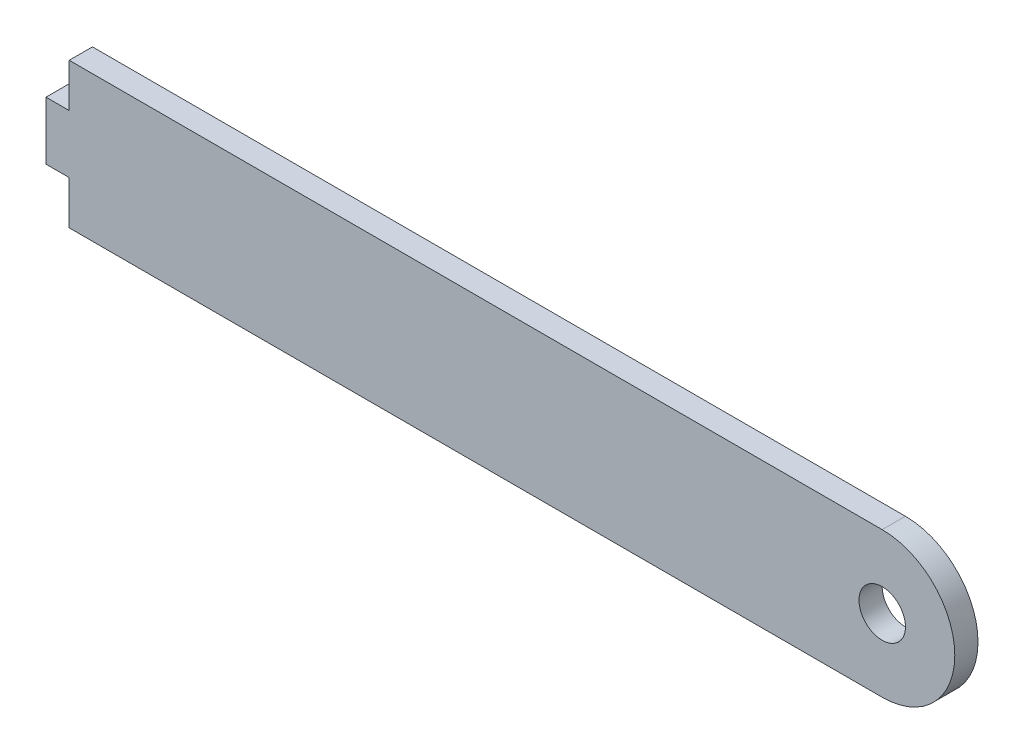
ISO-10303-21;
HEADER;
FILE_DESCRIPTION(('STEP AP214'),'2;1');
FILE_NAME('part.step','',(''),(''),'','','');
FILE_SCHEMA(('AUTOMOTIVE_DESIGN { 1 0 10303 214 1 1 1 1 }'));
ENDSEC;
DATA;
#1=APPLICATION_CONTEXT('core data for automotive mechanical design processes');
#2=APPLICATION_PROTOCOL_DEFINITION('international standard','automotive_design',2000,#1);
#3=PRODUCT_CONTEXT('',#1,'mechanical');
#4=PRODUCT('Part','Part','',(#3));
#5=PRODUCT_RELATED_PRODUCT_CATEGORY('part','',(#4));
#6=PRODUCT_DEFINITION_FORMATION('','',#4);
#7=PRODUCT_DEFINITION_CONTEXT('part definition',#1,'design');
#8=PRODUCT_DEFINITION('design','',#6,#7);
#9=PRODUCT_DEFINITION_SHAPE('','',#8);
#10=(LENGTH_UNIT() NAMED_UNIT(*) SI_UNIT(.MILLI.,.METRE.));
#11=(NAMED_UNIT(*) PLANE_ANGLE_UNIT() SI_UNIT($,.RADIAN.));
#12=(NAMED_UNIT(*) SI_UNIT($,.STERADIAN.) SOLID_ANGLE_UNIT());
#13=UNCERTAINTY_MEASURE_WITH_UNIT(LENGTH_MEASURE(1.E-05),#10,'distance_accuracy_value','');
#14=(GEOMETRIC_REPRESENTATION_CONTEXT(3) GLOBAL_UNCERTAINTY_ASSIGNED_CONTEXT((#13)) GLOBAL_UNIT_ASSIGNED_CONTEXT((#10,
#11,#12)) REPRESENTATION_CONTEXT('',''));
#15=CARTESIAN_POINT('',(0.,0.,0.));
#16=DIRECTION('',(0.,0.,1.));
#17=DIRECTION('',(1.,0.,0.));
#18=AXIS2_PLACEMENT_3D('',#15,#16,#17);
#19=CARTESIAN_POINT('',(91.7971875583889,-1.4616329157713,4.));
#20=DIRECTION('',(0.,0.,1.));
#21=DIRECTION('',(1.,0.,0.));
#22=AXIS2_PLACEMENT_3D('',#19,#20,#21);
#23=PLANE('',#22);
#24=DIRECTION('',(0.,-1.,0.));
#25=VECTOR('',#24,1.);
#26=CARTESIAN_POINT('',(-48.2028124416111,11.0383670842287,4.));
#27=LINE('',#26,#25);
#28=CARTESIAN_POINT('',(-48.2028124416111,11.0383670842287,4.));
#29=VERTEX_POINT('',#28);
#30=CARTESIAN_POINT('',(-48.2028124416111,3.53836708422869,4.));
#31=VERTEX_POINT('',#30);
#32=EDGE_CURVE('E168',#29,#31,#27,.T.);
#33=ORIENTED_EDGE('',*,*,#32,.T.);
#34=DIRECTION('',(-1.,0.,0.));
#35=VECTOR('',#34,1.);
#36=CARTESIAN_POINT('',(-48.2028124416111,3.53836708422869,4.));
#37=LINE('',#36,#35);
#38=CARTESIAN_POINT('',(-52.2028124416111,3.53836708422869,4.));
#39=VERTEX_POINT('',#38);
#40=EDGE_CURVE('E104',#31,#39,#37,.T.);
#41=ORIENTED_EDGE('',*,*,#40,.T.);
#42=DIRECTION('',(0.,-1.,0.));
#43=VECTOR('',#42,1.);
#44=CARTESIAN_POINT('',(-52.2028124416111,-6.46163291577131,4.));
#45=LINE('',#44,#43);
#46=CARTESIAN_POINT('',(-52.2028124416111,-6.46163291577131,4.));
#47=VERTEX_POINT('',#46);
#48=EDGE_CURVE('E189',#39,#47,#45,.T.);
#49=ORIENTED_EDGE('',*,*,#48,.T.);
#50=DIRECTION('',(1.,0.,0.));
#51=VECTOR('',#50,1.);
#52=CARTESIAN_POINT('',(-48.2028124416111,-6.4616329157713,4.));
#53=LINE('',#52,#51);
#54=CARTESIAN_POINT('',(-48.2028124416111,-6.4616329157713,4.));
#55=VERTEX_POINT('',#54);
#56=EDGE_CURVE('E203',#47,#55,#53,.T.);
#57=ORIENTED_EDGE('',*,*,#56,.T.);
#58=DIRECTION('',(0.,-1.,0.));
#59=VECTOR('',#58,1.);
#60=CARTESIAN_POINT('',(-48.2028124416111,-6.4616329157713,4.));
#61=LINE('',#60,#59);
#62=CARTESIAN_POINT('',(-48.2028124416111,-13.9616329157713,4.));
#63=VERTEX_POINT('',#62);
#64=EDGE_CURVE('E123',#55,#63,#61,.T.);
#65=ORIENTED_EDGE('',*,*,#64,.T.);
#66=DIRECTION('',(1.,0.,0.));
#67=VECTOR('',#66,1.);
#68=CARTESIAN_POINT('',(-48.2028124416111,-13.9616329157713,4.));
#69=LINE('',#68,#67);
#70=CARTESIAN_POINT('',(91.7971875583889,-13.9616329157713,4.));
#71=VERTEX_POINT('',#70);
#72=EDGE_CURVE('E117',#63,#71,#69,.T.);
#73=ORIENTED_EDGE('',*,*,#72,.T.);
#74=CARTESIAN_POINT('',(91.7971875583889,-1.4616329157713,4.));
#75=DIRECTION('',(0.,0.,1.));
#76=DIRECTION('',(1.,0.,0.));
#77=AXIS2_PLACEMENT_3D('',#74,#75,#76);
#78=CIRCLE('',#77,12.5);
#79=CARTESIAN_POINT('',(91.7971875583889,11.0383670842287,4.));
#80=VERTEX_POINT('',#79);
#81=EDGE_CURVE('E121',#71,#80,#78,.T.);
#82=ORIENTED_EDGE('',*,*,#81,.T.);
#83=DIRECTION('',(-1.,0.,0.));
#84=VECTOR('',#83,1.);
#85=CARTESIAN_POINT('',(-48.2028124416111,11.0383670842287,4.));
#86=LINE('',#85,#84);
#87=EDGE_CURVE('E61',#80,#29,#86,.T.);
#88=ORIENTED_EDGE('',*,*,#87,.T.);
#89=EDGE_LOOP('',(#33,#41,#49,#57,#65,#73,#82,#88));
#90=FACE_BOUND('',#89,.T.);
#91=CARTESIAN_POINT('',(91.7971875583889,-1.4616329157713,4.));
#92=DIRECTION('',(0.,0.,1.));
#93=DIRECTION('',(1.,0.,0.));
#94=AXIS2_PLACEMENT_3D('',#91,#92,#93);
#95=CIRCLE('',#94,4.00000000000001);
#96=CARTESIAN_POINT('',(95.7971875583889,-1.4616329157713,4.));
#97=VERTEX_POINT('',#96);
#98=EDGE_CURVE('E150',#97,#97,#95,.T.);
#99=ORIENTED_EDGE('',*,*,#98,.F.);
#100=EDGE_LOOP('',(#99));
#101=FACE_BOUND('',#100,.T.);
#102=ADVANCED_FACE('F43',(#90,#101),#23,.T.);
#103=CARTESIAN_POINT('',(91.7971875583889,-1.4616329157713,0.));
#104=DIRECTION('',(0.,0.,1.));
#105=DIRECTION('',(1.,0.,0.));
#106=AXIS2_PLACEMENT_3D('',#103,#104,#105);
#107=PLANE('',#106);
#108=DIRECTION('',(0.,-1.,0.));
#109=VECTOR('',#108,1.);
#110=CARTESIAN_POINT('',(-48.2028124416111,11.0383670842287,0.));
#111=LINE('',#110,#109);
#112=CARTESIAN_POINT('',(-48.2028124416111,11.0383670842287,0.));
#113=VERTEX_POINT('',#112);
#114=CARTESIAN_POINT('',(-48.2028124416111,3.53836708422869,0.));
#115=VERTEX_POINT('',#114);
#116=EDGE_CURVE('E145',#113,#115,#111,.T.);
#117=ORIENTED_EDGE('',*,*,#116,.F.);
#118=DIRECTION('',(-1.,0.,0.));
#119=VECTOR('',#118,1.);
#120=CARTESIAN_POINT('',(-48.2028124416111,11.0383670842287,0.));
#121=LINE('',#120,#119);
#122=CARTESIAN_POINT('',(91.7971875583889,11.0383670842287,0.));
#123=VERTEX_POINT('',#122);
#124=EDGE_CURVE('E96',#123,#113,#121,.T.);
#125=ORIENTED_EDGE('',*,*,#124,.F.);
#126=CARTESIAN_POINT('',(91.7971875583889,-1.4616329157713,0.));
#127=DIRECTION('',(0.,0.,1.));
#128=DIRECTION('',(1.,0.,0.));
#129=AXIS2_PLACEMENT_3D('',#126,#127,#128);
#130=CIRCLE('',#129,12.5);
#131=CARTESIAN_POINT('',(91.7971875583889,-13.9616329157713,0.));
#132=VERTEX_POINT('',#131);
#133=EDGE_CURVE('E90',#132,#123,#130,.T.);
#134=ORIENTED_EDGE('',*,*,#133,.F.);
#135=DIRECTION('',(1.,0.,0.));
#136=VECTOR('',#135,1.);
#137=CARTESIAN_POINT('',(-48.2028124416111,-13.9616329157713,0.));
#138=LINE('',#137,#136);
#139=CARTESIAN_POINT('',(-48.2028124416111,-13.9616329157713,0.));
#140=VERTEX_POINT('',#139);
#141=EDGE_CURVE('E132',#140,#132,#138,.T.);
#142=ORIENTED_EDGE('',*,*,#141,.F.);
#143=DIRECTION('',(0.,-1.,0.));
#144=VECTOR('',#143,1.);
#145=CARTESIAN_POINT('',(-48.2028124416111,-6.4616329157713,0.));
#146=LINE('',#145,#144);
#147=CARTESIAN_POINT('',(-48.2028124416111,-6.4616329157713,0.));
#148=VERTEX_POINT('',#147);
#149=EDGE_CURVE('E159',#148,#140,#146,.T.);
#150=ORIENTED_EDGE('',*,*,#149,.F.);
#151=DIRECTION('',(1.,0.,0.));
#152=VECTOR('',#151,1.);
#153=CARTESIAN_POINT('',(-48.2028124416111,-6.4616329157713,0.));
#154=LINE('',#153,#152);
#155=CARTESIAN_POINT('',(-52.2028124416111,-6.46163291577131,0.));
#156=VERTEX_POINT('',#155);
#157=EDGE_CURVE('E156',#156,#148,#154,.T.);
#158=ORIENTED_EDGE('',*,*,#157,.F.);
#159=DIRECTION('',(0.,-1.,0.));
#160=VECTOR('',#159,1.);
#161=CARTESIAN_POINT('',(-52.2028124416111,-6.46163291577131,0.));
#162=LINE('',#161,#160);
#163=CARTESIAN_POINT('',(-52.2028124416111,3.53836708422869,0.));
#164=VERTEX_POINT('',#163);
#165=EDGE_CURVE('E153',#164,#156,#162,.T.);
#166=ORIENTED_EDGE('',*,*,#165,.F.);
#167=DIRECTION('',(-1.,0.,0.));
#168=VECTOR('',#167,1.);
#169=CARTESIAN_POINT('',(-48.2028124416111,3.53836708422869,0.));
#170=LINE('',#169,#168);
#171=EDGE_CURVE('E149',#115,#164,#170,.T.);
#172=ORIENTED_EDGE('',*,*,#171,.F.);
#173=EDGE_LOOP('',(#117,#125,#134,#142,#150,#158,#166,#172));
#174=FACE_BOUND('',#173,.T.);
#175=CARTESIAN_POINT('',(91.7971875583889,-1.4616329157713,0.));
#176=DIRECTION('',(0.,0.,1.));
#177=DIRECTION('',(1.,0.,0.));
#178=AXIS2_PLACEMENT_3D('',#175,#176,#177);
#179=CIRCLE('',#178,4.00000000000001);
#180=CARTESIAN_POINT('',(95.7971875583889,-1.4616329157713,0.));
#181=VERTEX_POINT('',#180);
#182=EDGE_CURVE('E213',#181,#181,#179,.T.);
#183=ORIENTED_EDGE('',*,*,#182,.T.);
#184=EDGE_LOOP('',(#183));
#185=FACE_BOUND('',#184,.T.);
#186=ADVANCED_FACE('F193',(#174,#185),#107,.F.);
#187=CARTESIAN_POINT('',(-48.2028124416111,11.0383670842287,4.));
#188=DIRECTION('',(1.,0.,0.));
#189=DIRECTION('',(0.,1.,0.));
#190=AXIS2_PLACEMENT_3D('',#187,#188,#189);
#191=PLANE('',#190);
#192=ORIENTED_EDGE('',*,*,#116,.T.);
#193=DIRECTION('',(0.,0.,-1.));
#194=VECTOR('',#193,1.);
#195=CARTESIAN_POINT('',(-48.2028124416111,3.53836708422869,4.));
#196=LINE('',#195,#194);
#197=EDGE_CURVE('E11',#31,#115,#196,.T.);
#198=ORIENTED_EDGE('',*,*,#197,.F.);
#199=ORIENTED_EDGE('',*,*,#32,.F.);
#200=DIRECTION('',(0.,0.,-1.));
#201=VECTOR('',#200,1.);
#202=CARTESIAN_POINT('',(-48.2028124416111,11.0383670842287,4.));
#203=LINE('',#202,#201);
#204=EDGE_CURVE('E141',#29,#113,#203,.T.);
#205=ORIENTED_EDGE('',*,*,#204,.T.);
#206=EDGE_LOOP('',(#192,#198,#199,#205));
#207=FACE_BOUND('',#206,.T.);
#208=ADVANCED_FACE('F45',(#207),#191,.F.);
#209=CARTESIAN_POINT('',(-48.2028124416111,3.53836708422869,4.));
#210=DIRECTION('',(0.,-1.,0.));
#211=DIRECTION('',(1.,0.,0.));
#212=AXIS2_PLACEMENT_3D('',#209,#210,#211);
#213=PLANE('',#212);
#214=ORIENTED_EDGE('',*,*,#171,.T.);
#215=DIRECTION('',(0.,0.,-1.));
#216=VECTOR('',#215,1.);
#217=CARTESIAN_POINT('',(-52.2028124416111,3.53836708422869,4.));
#218=LINE('',#217,#216);
#219=EDGE_CURVE('E53',#39,#164,#218,.T.);
#220=ORIENTED_EDGE('',*,*,#219,.F.);
#221=ORIENTED_EDGE('',*,*,#40,.F.);
#222=ORIENTED_EDGE('',*,*,#197,.T.);
#223=EDGE_LOOP('',(#214,#220,#221,#222));
#224=FACE_BOUND('',#223,.T.);
#225=ADVANCED_FACE('F243',(#224),#213,.F.);
#226=CARTESIAN_POINT('',(-52.2028124416111,-6.46163291577131,4.));
#227=DIRECTION('',(1.,0.,0.));
#228=DIRECTION('',(0.,0.,-1.));
#229=AXIS2_PLACEMENT_3D('',#226,#227,#228);
#230=PLANE('',#229);
#231=ORIENTED_EDGE('',*,*,#165,.T.);
#232=DIRECTION('',(0.,0.,-1.));
#233=VECTOR('',#232,1.);
#234=CARTESIAN_POINT('',(-52.2028124416111,-6.46163291577131,4.));
#235=LINE('',#234,#233);
#236=EDGE_CURVE('E179',#47,#156,#235,.T.);
#237=ORIENTED_EDGE('',*,*,#236,.F.);
#238=ORIENTED_EDGE('',*,*,#48,.F.);
#239=ORIENTED_EDGE('',*,*,#219,.T.);
#240=EDGE_LOOP('',(#231,#237,#238,#239));
#241=FACE_BOUND('',#240,.T.);
#242=ADVANCED_FACE('F187',(#241),#230,.F.);
#243=CARTESIAN_POINT('',(-48.2028124416111,-6.4616329157713,4.));
#244=DIRECTION('',(0.,1.,0.));
#245=DIRECTION('',(-1.,0.,0.));
#246=AXIS2_PLACEMENT_3D('',#243,#244,#245);
#247=PLANE('',#246);
#248=ORIENTED_EDGE('',*,*,#157,.T.);
#249=DIRECTION('',(0.,0.,-1.));
#250=VECTOR('',#249,1.);
#251=CARTESIAN_POINT('',(-48.2028124416111,-6.4616329157713,4.));
#252=LINE('',#251,#250);
#253=EDGE_CURVE('E175',#55,#148,#252,.T.);
#254=ORIENTED_EDGE('',*,*,#253,.F.);
#255=ORIENTED_EDGE('',*,*,#56,.F.);
#256=ORIENTED_EDGE('',*,*,#236,.T.);
#257=EDGE_LOOP('',(#248,#254,#255,#256));
#258=FACE_BOUND('',#257,.T.);
#259=ADVANCED_FACE('F198',(#258),#247,.F.);
#260=CARTESIAN_POINT('',(-48.2028124416111,-6.4616329157713,4.));
#261=DIRECTION('',(1.,0.,0.));
#262=DIRECTION('',(0.,1.,0.));
#263=AXIS2_PLACEMENT_3D('',#260,#261,#262);
#264=PLANE('',#263);
#265=ORIENTED_EDGE('',*,*,#149,.T.);
#266=DIRECTION('',(0.,0.,-1.));
#267=VECTOR('',#266,1.);
#268=CARTESIAN_POINT('',(-48.2028124416111,-13.9616329157713,4.));
#269=LINE('',#268,#267);
#270=EDGE_CURVE('E134',#63,#140,#269,.T.);
#271=ORIENTED_EDGE('',*,*,#270,.F.);
#272=ORIENTED_EDGE('',*,*,#64,.F.);
#273=ORIENTED_EDGE('',*,*,#253,.T.);
#274=EDGE_LOOP('',(#265,#271,#272,#273));
#275=FACE_BOUND('',#274,.T.);
#276=ADVANCED_FACE('F201',(#275),#264,.F.);
#277=CARTESIAN_POINT('',(-48.2028124416111,-13.9616329157713,4.));
#278=DIRECTION('',(0.,1.,0.));
#279=DIRECTION('',(0.,0.,1.));
#280=AXIS2_PLACEMENT_3D('',#277,#278,#279);
#281=PLANE('',#280);
#282=ORIENTED_EDGE('',*,*,#141,.T.);
#283=DIRECTION('',(0.,0.,-1.));
#284=VECTOR('',#283,1.);
#285=CARTESIAN_POINT('',(91.7971875583889,-13.9616329157713,4.));
#286=LINE('',#285,#284);
#287=EDGE_CURVE('E129',#71,#132,#286,.T.);
#288=ORIENTED_EDGE('',*,*,#287,.F.);
#289=ORIENTED_EDGE('',*,*,#72,.F.);
#290=ORIENTED_EDGE('',*,*,#270,.T.);
#291=EDGE_LOOP('',(#282,#288,#289,#290));
#292=FACE_BOUND('',#291,.T.);
#293=ADVANCED_FACE('F130',(#292),#281,.F.);
#294=CARTESIAN_POINT('',(91.7971875583889,-1.4616329157713,4.));
#295=DIRECTION('',(0.,0.,-1.));
#296=DIRECTION('',(-1.,0.,0.));
#297=AXIS2_PLACEMENT_3D('',#294,#295,#296);
#298=CYLINDRICAL_SURFACE('',#297,12.5);
#299=ORIENTED_EDGE('',*,*,#133,.T.);
#300=DIRECTION('',(0.,0.,-1.));
#301=VECTOR('',#300,1.);
#302=CARTESIAN_POINT('',(91.7971875583889,11.0383670842287,4.));
#303=LINE('',#302,#301);
#304=EDGE_CURVE('E135',#80,#123,#303,.T.);
#305=ORIENTED_EDGE('',*,*,#304,.F.);
#306=ORIENTED_EDGE('',*,*,#81,.F.);
#307=ORIENTED_EDGE('',*,*,#287,.T.);
#308=EDGE_LOOP('',(#299,#305,#306,#307));
#309=FACE_BOUND('',#308,.T.);
#310=ADVANCED_FACE('F137',(#309),#298,.T.);
#311=CARTESIAN_POINT('',(-48.2028124416111,11.0383670842287,4.));
#312=DIRECTION('',(0.,-1.,0.));
#313=DIRECTION('',(1.,0.,0.));
#314=AXIS2_PLACEMENT_3D('',#311,#312,#313);
#315=PLANE('',#314);
#316=ORIENTED_EDGE('',*,*,#124,.T.);
#317=ORIENTED_EDGE('',*,*,#204,.F.);
#318=ORIENTED_EDGE('',*,*,#87,.F.);
#319=ORIENTED_EDGE('',*,*,#304,.T.);
#320=EDGE_LOOP('',(#316,#317,#318,#319));
#321=FACE_BOUND('',#320,.T.);
#322=ADVANCED_FACE('F231',(#321),#315,.F.);
#323=CARTESIAN_POINT('',(91.7971875583889,-1.4616329157713,4.));
#324=DIRECTION('',(0.,0.,-1.));
#325=DIRECTION('',(-1.,0.,0.));
#326=AXIS2_PLACEMENT_3D('',#323,#324,#325);
#327=CYLINDRICAL_SURFACE('',#326,4.00000000000001);
#328=ORIENTED_EDGE('',*,*,#98,.T.);
#329=EDGE_LOOP('',(#328));
#330=FACE_BOUND('',#329,.T.);
#331=ORIENTED_EDGE('',*,*,#182,.F.);
#332=EDGE_LOOP('',(#331));
#333=FACE_BOUND('',#332,.T.);
#334=ADVANCED_FACE('F221',(#330,#333),#327,.F.);
#335=CLOSED_SHELL('',(#102,#186,#208,#225,#242,#259,#276,#293,#310,#322,#334));
#336=MANIFOLD_SOLID_BREP('B2',#335);
#337=ADVANCED_BREP_SHAPE_REPRESENTATION('',(#18,#336),#14);
#338=SHAPE_DEFINITION_REPRESENTATION(#9,#337);
ENDSEC;
END-ISO-10303-21;
